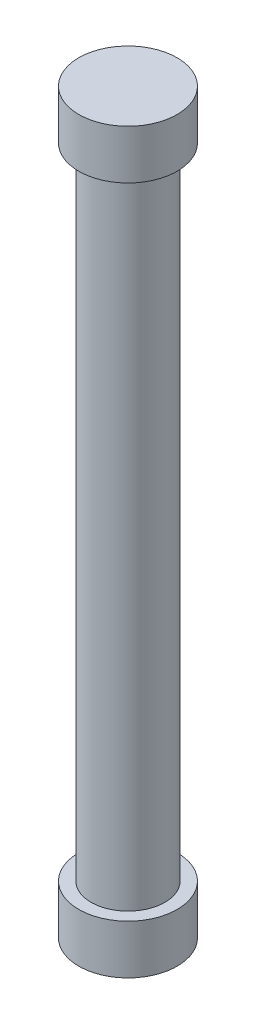
ISO-10303-21;
HEADER;
FILE_DESCRIPTION(('STEP AP214'),'2;1');
FILE_NAME('part.step','',(''),(''),'','','');
FILE_SCHEMA(('AUTOMOTIVE_DESIGN { 1 0 10303 214 1 1 1 1 }'));
ENDSEC;
DATA;
#1=APPLICATION_CONTEXT('core data for automotive mechanical design processes');
#2=APPLICATION_PROTOCOL_DEFINITION('international standard','automotive_design',2000,#1);
#3=PRODUCT_CONTEXT('',#1,'mechanical');
#4=PRODUCT('Part','Part','',(#3));
#5=PRODUCT_RELATED_PRODUCT_CATEGORY('part','',(#4));
#6=PRODUCT_DEFINITION_FORMATION('','',#4);
#7=PRODUCT_DEFINITION_CONTEXT('part definition',#1,'design');
#8=PRODUCT_DEFINITION('design','',#6,#7);
#9=PRODUCT_DEFINITION_SHAPE('','',#8);
#10=(LENGTH_UNIT() NAMED_UNIT(*) SI_UNIT(.MILLI.,.METRE.));
#11=(NAMED_UNIT(*) PLANE_ANGLE_UNIT() SI_UNIT($,.RADIAN.));
#12=(NAMED_UNIT(*) SI_UNIT($,.STERADIAN.) SOLID_ANGLE_UNIT());
#13=UNCERTAINTY_MEASURE_WITH_UNIT(LENGTH_MEASURE(1.E-05),#10,'distance_accuracy_value','');
#14=(GEOMETRIC_REPRESENTATION_CONTEXT(3) GLOBAL_UNCERTAINTY_ASSIGNED_CONTEXT((#13)) GLOBAL_UNIT_ASSIGNED_CONTEXT((#10,
#11,#12)) REPRESENTATION_CONTEXT('',''));
#15=CARTESIAN_POINT('',(0.,0.,0.));
#16=DIRECTION('',(0.,0.,1.));
#17=DIRECTION('',(1.,0.,0.));
#18=AXIS2_PLACEMENT_3D('',#15,#16,#17);
#19=CARTESIAN_POINT('',(0.,-30.,0.));
#20=DIRECTION('',(0.,-1.,0.));
#21=DIRECTION('',(1.,0.,0.));
#22=AXIS2_PLACEMENT_3D('',#19,#20,#21);
#23=PLANE('',#22);
#24=CARTESIAN_POINT('',(0.,-30.,0.));
#25=DIRECTION('',(0.,1.,0.));
#26=DIRECTION('',(-1.,0.,0.));
#27=AXIS2_PLACEMENT_3D('',#24,#25,#26);
#28=CIRCLE('',#27,1.99999999999998);
#29=CARTESIAN_POINT('',(-1.99999999999998,-30.,0.));
#30=VERTEX_POINT('',#29);
#31=EDGE_CURVE('E10',#30,#30,#28,.T.);
#32=ORIENTED_EDGE('',*,*,#31,.F.);
#33=EDGE_LOOP('',(#32));
#34=FACE_BOUND('',#33,.T.);
#35=ADVANCED_FACE('F40',(#34),#23,.T.);
#36=CARTESIAN_POINT('',(0.,0.,0.));
#37=DIRECTION('',(0.,1.,0.));
#38=DIRECTION('',(-1.,0.,0.));
#39=AXIS2_PLACEMENT_3D('',#36,#37,#38);
#40=CYLINDRICAL_SURFACE('',#39,1.99999999999998);
#41=ORIENTED_EDGE('',*,*,#31,.T.);
#42=EDGE_LOOP('',(#41));
#43=FACE_BOUND('',#42,.T.);
#44=CARTESIAN_POINT('',(0.,-28.,0.));
#45=DIRECTION('',(0.,1.,0.));
#46=DIRECTION('',(-1.,0.,0.));
#47=AXIS2_PLACEMENT_3D('',#44,#45,#46);
#48=CIRCLE('',#47,1.99999999999998);
#49=CARTESIAN_POINT('',(-1.99999999999998,-28.,0.));
#50=VERTEX_POINT('',#49);
#51=EDGE_CURVE('E47',#50,#50,#48,.T.);
#52=ORIENTED_EDGE('',*,*,#51,.F.);
#53=EDGE_LOOP('',(#52));
#54=FACE_BOUND('',#53,.T.);
#55=ADVANCED_FACE('F88',(#43,#54),#40,.T.);
#56=CARTESIAN_POINT('',(-1.99999999999998,-28.,0.));
#57=DIRECTION('',(0.,1.,0.));
#58=DIRECTION('',(-1.,0.,0.));
#59=AXIS2_PLACEMENT_3D('',#56,#57,#58);
#60=PLANE('',#59);
#61=ORIENTED_EDGE('',*,*,#51,.T.);
#62=EDGE_LOOP('',(#61));
#63=FACE_BOUND('',#62,.T.);
#64=CARTESIAN_POINT('',(0.,-28.,0.));
#65=DIRECTION('',(0.,1.,0.));
#66=DIRECTION('',(-1.,0.,0.));
#67=AXIS2_PLACEMENT_3D('',#64,#65,#66);
#68=CIRCLE('',#67,1.49999999999998);
#69=CARTESIAN_POINT('',(-1.49999999999998,-28.,0.));
#70=VERTEX_POINT('',#69);
#71=EDGE_CURVE('E52',#70,#70,#68,.T.);
#72=ORIENTED_EDGE('',*,*,#71,.F.);
#73=EDGE_LOOP('',(#72));
#74=FACE_BOUND('',#73,.T.);
#75=ADVANCED_FACE('F93',(#63,#74),#60,.T.);
#76=CARTESIAN_POINT('',(0.,0.,0.));
#77=DIRECTION('',(0.,1.,0.));
#78=DIRECTION('',(-1.,0.,0.));
#79=AXIS2_PLACEMENT_3D('',#76,#77,#78);
#80=CYLINDRICAL_SURFACE('',#79,1.49999999999998);
#81=ORIENTED_EDGE('',*,*,#71,.T.);
#82=EDGE_LOOP('',(#81));
#83=FACE_BOUND('',#82,.T.);
#84=CARTESIAN_POINT('',(0.,-2.,0.));
#85=DIRECTION('',(0.,1.,0.));
#86=DIRECTION('',(-1.,0.,0.));
#87=AXIS2_PLACEMENT_3D('',#84,#85,#86);
#88=CIRCLE('',#87,1.49999999999998);
#89=CARTESIAN_POINT('',(-1.49999999999998,-2.,0.));
#90=VERTEX_POINT('',#89);
#91=EDGE_CURVE('E57',#90,#90,#88,.T.);
#92=ORIENTED_EDGE('',*,*,#91,.F.);
#93=EDGE_LOOP('',(#92));
#94=FACE_BOUND('',#93,.T.);
#95=ADVANCED_FACE('F84',(#83,#94),#80,.T.);
#96=CARTESIAN_POINT('',(-1.49999999999998,-2.,0.));
#97=DIRECTION('',(0.,-1.,0.));
#98=DIRECTION('',(1.,0.,0.));
#99=AXIS2_PLACEMENT_3D('',#96,#97,#98);
#100=PLANE('',#99);
#101=ORIENTED_EDGE('',*,*,#91,.T.);
#102=EDGE_LOOP('',(#101));
#103=FACE_BOUND('',#102,.T.);
#104=CARTESIAN_POINT('',(0.,-2.,0.));
#105=DIRECTION('',(0.,1.,0.));
#106=DIRECTION('',(-1.,0.,0.));
#107=AXIS2_PLACEMENT_3D('',#104,#105,#106);
#108=CIRCLE('',#107,2.);
#109=CARTESIAN_POINT('',(-2.,-2.,0.));
#110=VERTEX_POINT('',#109);
#111=EDGE_CURVE('E63',#110,#110,#108,.T.);
#112=ORIENTED_EDGE('',*,*,#111,.F.);
#113=EDGE_LOOP('',(#112));
#114=FACE_BOUND('',#113,.T.);
#115=ADVANCED_FACE('F76',(#103,#114),#100,.T.);
#116=CARTESIAN_POINT('',(0.,0.,0.));
#117=DIRECTION('',(0.,1.,0.));
#118=DIRECTION('',(-1.,0.,0.));
#119=AXIS2_PLACEMENT_3D('',#116,#117,#118);
#120=CYLINDRICAL_SURFACE('',#119,2.);
#121=ORIENTED_EDGE('',*,*,#111,.T.);
#122=EDGE_LOOP('',(#121));
#123=FACE_BOUND('',#122,.T.);
#124=CARTESIAN_POINT('',(0.,0.,0.));
#125=DIRECTION('',(0.,1.,0.));
#126=DIRECTION('',(-1.,0.,0.));
#127=AXIS2_PLACEMENT_3D('',#124,#125,#126);
#128=CIRCLE('',#127,2.);
#129=CARTESIAN_POINT('',(-2.,0.,0.));
#130=VERTEX_POINT('',#129);
#131=EDGE_CURVE('E67',#130,#130,#128,.T.);
#132=ORIENTED_EDGE('',*,*,#131,.F.);
#133=EDGE_LOOP('',(#132));
#134=FACE_BOUND('',#133,.T.);
#135=ADVANCED_FACE('F74',(#123,#134),#120,.T.);
#136=CARTESIAN_POINT('',(-2.,0.,0.));
#137=DIRECTION('',(0.,1.,0.));
#138=DIRECTION('',(-1.,0.,0.));
#139=AXIS2_PLACEMENT_3D('',#136,#137,#138);
#140=PLANE('',#139);
#141=ORIENTED_EDGE('',*,*,#131,.T.);
#142=EDGE_LOOP('',(#141));
#143=FACE_BOUND('',#142,.T.);
#144=ADVANCED_FACE('F72',(#143),#140,.T.);
#145=CLOSED_SHELL('',(#35,#55,#75,#95,#115,#135,#144));
#146=MANIFOLD_SOLID_BREP('B2',#145);
#147=ADVANCED_BREP_SHAPE_REPRESENTATION('',(#18,#146),#14);
#148=SHAPE_DEFINITION_REPRESENTATION(#9,#147);
ENDSEC;
END-ISO-10303-21;
